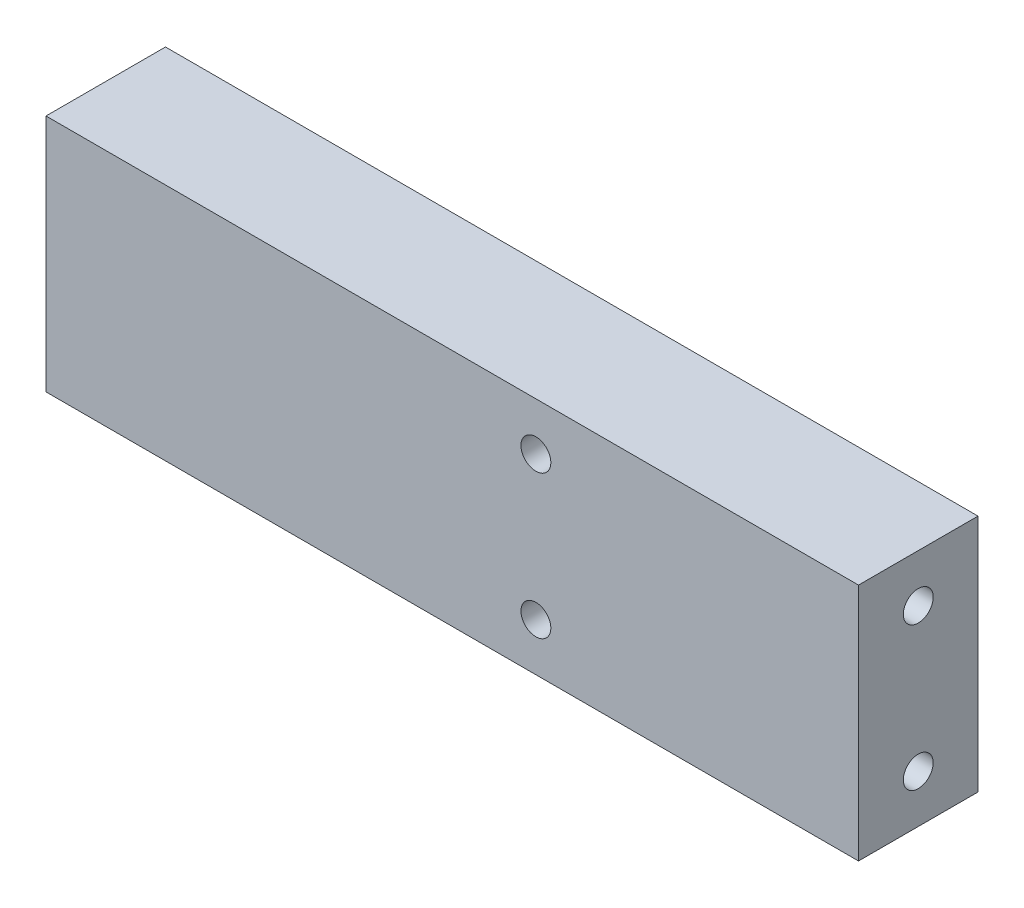
ISO-10303-21;
HEADER;
FILE_DESCRIPTION(('STEP AP214'),'2;1');
FILE_NAME('part.step','',(''),(''),'','','');
FILE_SCHEMA(('AUTOMOTIVE_DESIGN { 1 0 10303 214 1 1 1 1 }'));
ENDSEC;
DATA;
#1=APPLICATION_CONTEXT('core data for automotive mechanical design processes');
#2=APPLICATION_PROTOCOL_DEFINITION('international standard','automotive_design',2000,#1);
#3=PRODUCT_CONTEXT('',#1,'mechanical');
#4=PRODUCT('Part','Part','',(#3));
#5=PRODUCT_RELATED_PRODUCT_CATEGORY('part','',(#4));
#6=PRODUCT_DEFINITION_FORMATION('','',#4);
#7=PRODUCT_DEFINITION_CONTEXT('part definition',#1,'design');
#8=PRODUCT_DEFINITION('design','',#6,#7);
#9=PRODUCT_DEFINITION_SHAPE('','',#8);
#10=(LENGTH_UNIT() NAMED_UNIT(*) SI_UNIT(.MILLI.,.METRE.));
#11=(NAMED_UNIT(*) PLANE_ANGLE_UNIT() SI_UNIT($,.RADIAN.));
#12=(NAMED_UNIT(*) SI_UNIT($,.STERADIAN.) SOLID_ANGLE_UNIT());
#13=UNCERTAINTY_MEASURE_WITH_UNIT(LENGTH_MEASURE(1.E-05),#10,'distance_accuracy_value','');
#14=(GEOMETRIC_REPRESENTATION_CONTEXT(3) GLOBAL_UNCERTAINTY_ASSIGNED_CONTEXT((#13)) GLOBAL_UNIT_ASSIGNED_CONTEXT((#10,
#11,#12)) REPRESENTATION_CONTEXT('',''));
#15=CARTESIAN_POINT('',(0.,0.,0.));
#16=DIRECTION('',(0.,0.,1.));
#17=DIRECTION('',(1.,0.,0.));
#18=AXIS2_PLACEMENT_3D('',#15,#16,#17);
#19=CARTESIAN_POINT('',(7.,16.,2.50000000005457));
#20=DIRECTION('',(0.,0.,1.));
#21=DIRECTION('',(1.,0.,0.));
#22=AXIS2_PLACEMENT_3D('',#19,#20,#21);
#23=CONICAL_SURFACE('',#22,1.25000000003228,1.02974425855842);
#24=CARTESIAN_POINT('',(6.99999999991974,16.,1.74892422620587));
#25=VERTEX_POINT('',#24);
#26=VERTEX_LOOP('',#25);
#27=FACE_BOUND('',#26,.T.);
#28=CARTESIAN_POINT('',(7.,16.,2.5));
#29=DIRECTION('',(0.,0.,1.));
#30=DIRECTION('',(1.,0.,0.));
#31=AXIS2_PLACEMENT_3D('',#28,#29,#30);
#32=CIRCLE('',#31,1.24999999999999);
#33=CARTESIAN_POINT('',(8.24999999999999,16.,2.5));
#34=VERTEX_POINT('',#33);
#35=EDGE_CURVE('E77',#34,#34,#32,.T.);
#36=ORIENTED_EDGE('',*,*,#35,.T.);
#37=EDGE_LOOP('',(#36));
#38=FACE_BOUND('',#37,.T.);
#39=ADVANCED_FACE('F16',(#27,#38),#23,.F.);
#40=CARTESIAN_POINT('',(7.,4.,2.50000000005457));
#41=DIRECTION('',(0.,0.,1.));
#42=DIRECTION('',(1.,0.,0.));
#43=AXIS2_PLACEMENT_3D('',#40,#41,#42);
#44=CONICAL_SURFACE('',#43,1.25000000003228,1.02974425855842);
#45=CARTESIAN_POINT('',(6.99999999991974,4.,1.74892422620587));
#46=VERTEX_POINT('',#45);
#47=VERTEX_LOOP('',#46);
#48=FACE_BOUND('',#47,.T.);
#49=CARTESIAN_POINT('',(7.,4.,2.5));
#50=DIRECTION('',(0.,0.,1.));
#51=DIRECTION('',(1.,0.,0.));
#52=AXIS2_PLACEMENT_3D('',#49,#50,#51);
#53=CIRCLE('',#52,1.24999999999999);
#54=CARTESIAN_POINT('',(8.24999999999999,4.,2.5));
#55=VERTEX_POINT('',#54);
#56=EDGE_CURVE('E79',#55,#55,#53,.T.);
#57=ORIENTED_EDGE('',*,*,#56,.T.);
#58=EDGE_LOOP('',(#57));
#59=FACE_BOUND('',#58,.T.);
#60=ADVANCED_FACE('F74',(#48,#59),#44,.F.);
#61=CARTESIAN_POINT('',(25.5000000000223,16.,5.));
#62=DIRECTION('',(1.,0.,0.));
#63=DIRECTION('',(0.,0.,-1.));
#64=AXIS2_PLACEMENT_3D('',#61,#62,#63);
#65=CONICAL_SURFACE('',#64,1.24999999991815,1.02974425860485);
#66=CARTESIAN_POINT('',(24.7489242262589,16.,5.00000000005684));
#67=VERTEX_POINT('',#66);
#68=VERTEX_LOOP('',#67);
#69=FACE_BOUND('',#68,.T.);
#70=CARTESIAN_POINT('',(25.5,16.,5.));
#71=DIRECTION('',(1.,0.,0.));
#72=DIRECTION('',(0.,0.,-1.));
#73=AXIS2_PLACEMENT_3D('',#70,#71,#72);
#74=CIRCLE('',#73,1.24999999999999);
#75=CARTESIAN_POINT('',(25.5,16.,3.75000000000001));
#76=VERTEX_POINT('',#75);
#77=EDGE_CURVE('E82',#76,#76,#74,.T.);
#78=ORIENTED_EDGE('',*,*,#77,.T.);
#79=EDGE_LOOP('',(#78));
#80=FACE_BOUND('',#79,.T.);
#81=ADVANCED_FACE('F123',(#69,#80),#65,.F.);
#82=CARTESIAN_POINT('',(25.5000000000223,4.,5.));
#83=DIRECTION('',(1.,0.,0.));
#84=DIRECTION('',(0.,0.,-1.));
#85=AXIS2_PLACEMENT_3D('',#82,#83,#84);
#86=CONICAL_SURFACE('',#85,1.25000000003183,1.02974425868194);
#87=CARTESIAN_POINT('',(24.7489242262304,4.,5.));
#88=VERTEX_POINT('',#87);
#89=VERTEX_LOOP('',#88);
#90=FACE_BOUND('',#89,.T.);
#91=CARTESIAN_POINT('',(25.5,4.,5.));
#92=DIRECTION('',(1.,0.,0.));
#93=DIRECTION('',(0.,0.,-1.));
#94=AXIS2_PLACEMENT_3D('',#91,#92,#93);
#95=CIRCLE('',#94,1.24999999999999);
#96=CARTESIAN_POINT('',(25.5,4.,3.75000000000001));
#97=VERTEX_POINT('',#96);
#98=EDGE_CURVE('E115',#97,#97,#95,.T.);
#99=ORIENTED_EDGE('',*,*,#98,.T.);
#100=EDGE_LOOP('',(#99));
#101=FACE_BOUND('',#100,.T.);
#102=ADVANCED_FACE('F220',(#90,#101),#86,.F.);
#103=CARTESIAN_POINT('',(-25.4999999999654,16.,5.));
#104=DIRECTION('',(-1.,0.,0.));
#105=DIRECTION('',(0.,-1.,0.));
#106=AXIS2_PLACEMENT_3D('',#103,#104,#105);
#107=CONICAL_SURFACE('',#106,1.24999999985221,1.02974425855827);
#108=CARTESIAN_POINT('',(-24.748924226202,16.,4.99999999994316));
#109=VERTEX_POINT('',#108);
#110=VERTEX_LOOP('',#109);
#111=FACE_BOUND('',#110,.T.);
#112=CARTESIAN_POINT('',(-25.5,16.,5.));
#113=DIRECTION('',(-1.,0.,0.));
#114=DIRECTION('',(0.,0.,1.));
#115=AXIS2_PLACEMENT_3D('',#112,#113,#114);
#116=CIRCLE('',#115,1.24999999999999);
#117=CARTESIAN_POINT('',(-25.5,16.,6.24999999999999));
#118=VERTEX_POINT('',#117);
#119=EDGE_CURVE('E110',#118,#118,#116,.T.);
#120=ORIENTED_EDGE('',*,*,#119,.T.);
#121=EDGE_LOOP('',(#120));
#122=FACE_BOUND('',#121,.T.);
#123=ADVANCED_FACE('F216',(#111,#122),#107,.F.);
#124=CARTESIAN_POINT('',(-25.4999999999654,4.,5.));
#125=DIRECTION('',(-1.,0.,0.));
#126=DIRECTION('',(0.,-1.,0.));
#127=AXIS2_PLACEMENT_3D('',#124,#125,#126);
#128=CONICAL_SURFACE('',#127,1.24999999996589,1.02974425863858);
#129=CARTESIAN_POINT('',(-24.7489242261736,4.,5.));
#130=VERTEX_POINT('',#129);
#131=VERTEX_LOOP('',#130);
#132=FACE_BOUND('',#131,.T.);
#133=CARTESIAN_POINT('',(-25.5,4.,5.));
#134=DIRECTION('',(-1.,0.,0.));
#135=DIRECTION('',(0.,0.,1.));
#136=AXIS2_PLACEMENT_3D('',#133,#134,#135);
#137=CIRCLE('',#136,1.24999999999999);
#138=CARTESIAN_POINT('',(-25.5,4.,6.24999999999999));
#139=VERTEX_POINT('',#138);
#140=EDGE_CURVE('E106',#139,#139,#137,.T.);
#141=ORIENTED_EDGE('',*,*,#140,.T.);
#142=EDGE_LOOP('',(#141));
#143=FACE_BOUND('',#142,.T.);
#144=ADVANCED_FACE('F212',(#132,#143),#128,.F.);
#145=CARTESIAN_POINT('',(7.,16.,10.));
#146=DIRECTION('',(0.,0.,1.));
#147=DIRECTION('',(1.,0.,0.));
#148=AXIS2_PLACEMENT_3D('',#145,#146,#147);
#149=CYLINDRICAL_SURFACE('',#148,1.24999999999999);
#150=CARTESIAN_POINT('',(7.,16.,10.));
#151=DIRECTION('',(0.,0.,1.));
#152=DIRECTION('',(1.,0.,0.));
#153=AXIS2_PLACEMENT_3D('',#150,#151,#152);
#154=CIRCLE('',#153,1.24999999999999);
#155=CARTESIAN_POINT('',(8.24999999999999,16.,10.));
#156=VERTEX_POINT('',#155);
#157=EDGE_CURVE('E19',#156,#156,#154,.F.);
#158=ORIENTED_EDGE('',*,*,#157,.F.);
#159=EDGE_LOOP('',(#158));
#160=FACE_BOUND('',#159,.T.);
#161=ORIENTED_EDGE('',*,*,#35,.F.);
#162=EDGE_LOOP('',(#161));
#163=FACE_BOUND('',#162,.T.);
#164=ADVANCED_FACE('F208',(#160,#163),#149,.F.);
#165=CARTESIAN_POINT('',(7.,4.,10.));
#166=DIRECTION('',(0.,0.,1.));
#167=DIRECTION('',(1.,0.,0.));
#168=AXIS2_PLACEMENT_3D('',#165,#166,#167);
#169=CYLINDRICAL_SURFACE('',#168,1.24999999999999);
#170=CARTESIAN_POINT('',(7.,4.,10.));
#171=DIRECTION('',(0.,0.,1.));
#172=DIRECTION('',(1.,0.,0.));
#173=AXIS2_PLACEMENT_3D('',#170,#171,#172);
#174=CIRCLE('',#173,1.24999999999999);
#175=CARTESIAN_POINT('',(8.24999999999999,4.,10.));
#176=VERTEX_POINT('',#175);
#177=EDGE_CURVE('E100',#176,#176,#174,.F.);
#178=ORIENTED_EDGE('',*,*,#177,.F.);
#179=EDGE_LOOP('',(#178));
#180=FACE_BOUND('',#179,.T.);
#181=ORIENTED_EDGE('',*,*,#56,.F.);
#182=EDGE_LOOP('',(#181));
#183=FACE_BOUND('',#182,.T.);
#184=ADVANCED_FACE('F129',(#180,#183),#169,.F.);
#185=CARTESIAN_POINT('',(34.,16.,5.));
#186=DIRECTION('',(1.,0.,0.));
#187=DIRECTION('',(0.,0.,-1.));
#188=AXIS2_PLACEMENT_3D('',#185,#186,#187);
#189=CYLINDRICAL_SURFACE('',#188,1.24999999999999);
#190=ORIENTED_EDGE('',*,*,#77,.F.);
#191=EDGE_LOOP('',(#190));
#192=FACE_BOUND('',#191,.T.);
#193=CARTESIAN_POINT('',(34.,16.,5.));
#194=DIRECTION('',(1.,0.,0.));
#195=DIRECTION('',(0.,0.,-1.));
#196=AXIS2_PLACEMENT_3D('',#193,#194,#195);
#197=CIRCLE('',#196,1.24999999999999);
#198=CARTESIAN_POINT('',(34.,16.,3.75000000000001));
#199=VERTEX_POINT('',#198);
#200=EDGE_CURVE('E97',#199,#199,#197,.T.);
#201=ORIENTED_EDGE('',*,*,#200,.T.);
#202=EDGE_LOOP('',(#201));
#203=FACE_BOUND('',#202,.T.);
#204=ADVANCED_FACE('F125',(#192,#203),#189,.F.);
#205=CARTESIAN_POINT('',(34.,4.,5.));
#206=DIRECTION('',(1.,0.,0.));
#207=DIRECTION('',(0.,0.,-1.));
#208=AXIS2_PLACEMENT_3D('',#205,#206,#207);
#209=CYLINDRICAL_SURFACE('',#208,1.24999999999999);
#210=ORIENTED_EDGE('',*,*,#98,.F.);
#211=EDGE_LOOP('',(#210));
#212=FACE_BOUND('',#211,.T.);
#213=CARTESIAN_POINT('',(34.,4.,5.));
#214=DIRECTION('',(1.,0.,0.));
#215=DIRECTION('',(0.,0.,-1.));
#216=AXIS2_PLACEMENT_3D('',#213,#214,#215);
#217=CIRCLE('',#216,1.24999999999999);
#218=CARTESIAN_POINT('',(34.,4.,3.75000000000001));
#219=VERTEX_POINT('',#218);
#220=EDGE_CURVE('E93',#219,#219,#217,.T.);
#221=ORIENTED_EDGE('',*,*,#220,.T.);
#222=EDGE_LOOP('',(#221));
#223=FACE_BOUND('',#222,.T.);
#224=ADVANCED_FACE('F128',(#212,#223),#209,.F.);
#225=CARTESIAN_POINT('',(-34.,16.,5.));
#226=DIRECTION('',(-1.,0.,0.));
#227=DIRECTION('',(0.,0.,1.));
#228=AXIS2_PLACEMENT_3D('',#225,#226,#227);
#229=CYLINDRICAL_SURFACE('',#228,1.24999999999999);
#230=ORIENTED_EDGE('',*,*,#119,.F.);
#231=EDGE_LOOP('',(#230));
#232=FACE_BOUND('',#231,.T.);
#233=CARTESIAN_POINT('',(-34.,16.,5.));
#234=DIRECTION('',(-1.,0.,0.));
#235=DIRECTION('',(0.,0.,1.));
#236=AXIS2_PLACEMENT_3D('',#233,#234,#235);
#237=CIRCLE('',#236,1.24999999999999);
#238=CARTESIAN_POINT('',(-34.,16.,6.24999999999999));
#239=VERTEX_POINT('',#238);
#240=EDGE_CURVE('E89',#239,#239,#237,.T.);
#241=ORIENTED_EDGE('',*,*,#240,.T.);
#242=EDGE_LOOP('',(#241));
#243=FACE_BOUND('',#242,.T.);
#244=ADVANCED_FACE('F190',(#232,#243),#229,.F.);
#245=CARTESIAN_POINT('',(-34.,4.,5.));
#246=DIRECTION('',(-1.,0.,0.));
#247=DIRECTION('',(0.,0.,1.));
#248=AXIS2_PLACEMENT_3D('',#245,#246,#247);
#249=CYLINDRICAL_SURFACE('',#248,1.24999999999999);
#250=ORIENTED_EDGE('',*,*,#140,.F.);
#251=EDGE_LOOP('',(#250));
#252=FACE_BOUND('',#251,.T.);
#253=CARTESIAN_POINT('',(-34.,4.,5.));
#254=DIRECTION('',(-1.,0.,0.));
#255=DIRECTION('',(0.,0.,1.));
#256=AXIS2_PLACEMENT_3D('',#253,#254,#255);
#257=CIRCLE('',#256,1.24999999999999);
#258=CARTESIAN_POINT('',(-34.,4.,6.24999999999999));
#259=VERTEX_POINT('',#258);
#260=EDGE_CURVE('E86',#259,#259,#257,.T.);
#261=ORIENTED_EDGE('',*,*,#260,.T.);
#262=EDGE_LOOP('',(#261));
#263=FACE_BOUND('',#262,.T.);
#264=ADVANCED_FACE('F192',(#252,#263),#249,.F.);
#265=CARTESIAN_POINT('',(0.,0.,10.));
#266=DIRECTION('',(0.,0.,1.));
#267=DIRECTION('',(1.,0.,0.));
#268=AXIS2_PLACEMENT_3D('',#265,#266,#267);
#269=PLANE('',#268);
#270=DIRECTION('',(0.,1.,0.));
#271=VECTOR('',#270,1.);
#272=CARTESIAN_POINT('',(34.,20.,10.));
#273=LINE('',#272,#271);
#274=CARTESIAN_POINT('',(34.,0.,10.));
#275=VERTEX_POINT('',#274);
#276=CARTESIAN_POINT('',(34.,20.,10.));
#277=VERTEX_POINT('',#276);
#278=EDGE_CURVE('E183',#275,#277,#273,.T.);
#279=ORIENTED_EDGE('',*,*,#278,.T.);
#280=DIRECTION('',(1.,0.,0.));
#281=VECTOR('',#280,1.);
#282=CARTESIAN_POINT('',(-34.,20.,10.));
#283=LINE('',#282,#281);
#284=CARTESIAN_POINT('',(-34.,20.,10.));
#285=VERTEX_POINT('',#284);
#286=EDGE_CURVE('E92',#277,#285,#283,.F.);
#287=ORIENTED_EDGE('',*,*,#286,.T.);
#288=DIRECTION('',(0.,1.,0.));
#289=VECTOR('',#288,1.);
#290=CARTESIAN_POINT('',(-34.,20.,10.));
#291=LINE('',#290,#289);
#292=CARTESIAN_POINT('',(-34.,0.,10.));
#293=VERTEX_POINT('',#292);
#294=EDGE_CURVE('E177',#285,#293,#291,.F.);
#295=ORIENTED_EDGE('',*,*,#294,.T.);
#296=DIRECTION('',(1.,0.,0.));
#297=VECTOR('',#296,1.);
#298=CARTESIAN_POINT('',(-34.,0.,10.));
#299=LINE('',#298,#297);
#300=EDGE_CURVE('E99',#293,#275,#299,.T.);
#301=ORIENTED_EDGE('',*,*,#300,.T.);
#302=EDGE_LOOP('',(#279,#287,#295,#301));
#303=FACE_BOUND('',#302,.T.);
#304=ORIENTED_EDGE('',*,*,#177,.T.);
#305=EDGE_LOOP('',(#304));
#306=FACE_BOUND('',#305,.T.);
#307=ORIENTED_EDGE('',*,*,#157,.T.);
#308=EDGE_LOOP('',(#307));
#309=FACE_BOUND('',#308,.T.);
#310=ADVANCED_FACE('F147',(#303,#306,#309),#269,.T.);
#311=CARTESIAN_POINT('',(-34.,0.,10.));
#312=DIRECTION('',(0.,1.,0.));
#313=DIRECTION('',(0.,0.,1.));
#314=AXIS2_PLACEMENT_3D('',#311,#312,#313);
#315=PLANE('',#314);
#316=DIRECTION('',(0.,0.,1.));
#317=VECTOR('',#316,1.);
#318=CARTESIAN_POINT('',(34.,0.,10.));
#319=LINE('',#318,#317);
#320=CARTESIAN_POINT('',(34.,0.,0.));
#321=VERTEX_POINT('',#320);
#322=EDGE_CURVE('E96',#321,#275,#319,.T.);
#323=ORIENTED_EDGE('',*,*,#322,.T.);
#324=ORIENTED_EDGE('',*,*,#300,.F.);
#325=DIRECTION('',(0.,0.,-1.));
#326=VECTOR('',#325,1.);
#327=CARTESIAN_POINT('',(-34.,0.,10.));
#328=LINE('',#327,#326);
#329=CARTESIAN_POINT('',(-34.,0.,0.));
#330=VERTEX_POINT('',#329);
#331=EDGE_CURVE('E172',#293,#330,#328,.T.);
#332=ORIENTED_EDGE('',*,*,#331,.T.);
#333=DIRECTION('',(1.,0.,0.));
#334=VECTOR('',#333,1.);
#335=CARTESIAN_POINT('',(0.,0.,0.));
#336=LINE('',#335,#334);
#337=EDGE_CURVE('E170',#330,#321,#336,.T.);
#338=ORIENTED_EDGE('',*,*,#337,.T.);
#339=EDGE_LOOP('',(#323,#324,#332,#338));
#340=FACE_BOUND('',#339,.T.);
#341=ADVANCED_FACE('F136',(#340),#315,.F.);
#342=CARTESIAN_POINT('',(34.,20.,10.));
#343=DIRECTION('',(-1.,0.,0.));
#344=DIRECTION('',(0.,0.,1.));
#345=AXIS2_PLACEMENT_3D('',#342,#343,#344);
#346=PLANE('',#345);
#347=DIRECTION('',(0.,0.,-1.));
#348=VECTOR('',#347,1.);
#349=CARTESIAN_POINT('',(34.,20.,10.));
#350=LINE('',#349,#348);
#351=CARTESIAN_POINT('',(34.,20.,0.));
#352=VERTEX_POINT('',#351);
#353=EDGE_CURVE('E168',#352,#277,#350,.F.);
#354=ORIENTED_EDGE('',*,*,#353,.T.);
#355=ORIENTED_EDGE('',*,*,#278,.F.);
#356=ORIENTED_EDGE('',*,*,#322,.F.);
#357=DIRECTION('',(0.,1.,0.));
#358=VECTOR('',#357,1.);
#359=CARTESIAN_POINT('',(34.,0.,0.));
#360=LINE('',#359,#358);
#361=EDGE_CURVE('E164',#321,#352,#360,.T.);
#362=ORIENTED_EDGE('',*,*,#361,.T.);
#363=EDGE_LOOP('',(#354,#355,#356,#362));
#364=FACE_BOUND('',#363,.T.);
#365=ORIENTED_EDGE('',*,*,#220,.F.);
#366=EDGE_LOOP('',(#365));
#367=FACE_BOUND('',#366,.T.);
#368=ORIENTED_EDGE('',*,*,#200,.F.);
#369=EDGE_LOOP('',(#368));
#370=FACE_BOUND('',#369,.T.);
#371=ADVANCED_FACE('F133',(#364,#367,#370),#346,.F.);
#372=CARTESIAN_POINT('',(-34.,20.,10.));
#373=DIRECTION('',(0.,-1.,0.));
#374=DIRECTION('',(0.,0.,-1.));
#375=AXIS2_PLACEMENT_3D('',#372,#373,#374);
#376=PLANE('',#375);
#377=DIRECTION('',(0.,0.,-1.));
#378=VECTOR('',#377,1.);
#379=CARTESIAN_POINT('',(-34.,20.,10.));
#380=LINE('',#379,#378);
#381=CARTESIAN_POINT('',(-34.,20.,0.));
#382=VERTEX_POINT('',#381);
#383=EDGE_CURVE('E33',#382,#285,#380,.F.);
#384=ORIENTED_EDGE('',*,*,#383,.T.);
#385=ORIENTED_EDGE('',*,*,#286,.F.);
#386=ORIENTED_EDGE('',*,*,#353,.F.);
#387=DIRECTION('',(1.,0.,0.));
#388=VECTOR('',#387,1.);
#389=CARTESIAN_POINT('',(0.,20.,0.));
#390=LINE('',#389,#388);
#391=EDGE_CURVE('E25',#352,#382,#390,.F.);
#392=ORIENTED_EDGE('',*,*,#391,.T.);
#393=EDGE_LOOP('',(#384,#385,#386,#392));
#394=FACE_BOUND('',#393,.T.);
#395=ADVANCED_FACE('F135',(#394),#376,.F.);
#396=CARTESIAN_POINT('',(-34.,20.,10.));
#397=DIRECTION('',(1.,0.,0.));
#398=DIRECTION('',(0.,0.,-1.));
#399=AXIS2_PLACEMENT_3D('',#396,#397,#398);
#400=PLANE('',#399);
#401=ORIENTED_EDGE('',*,*,#331,.F.);
#402=ORIENTED_EDGE('',*,*,#294,.F.);
#403=ORIENTED_EDGE('',*,*,#383,.F.);
#404=DIRECTION('',(0.,1.,0.));
#405=VECTOR('',#404,1.);
#406=CARTESIAN_POINT('',(-34.,0.,0.));
#407=LINE('',#406,#405);
#408=EDGE_CURVE('E11',#382,#330,#407,.F.);
#409=ORIENTED_EDGE('',*,*,#408,.T.);
#410=EDGE_LOOP('',(#401,#402,#403,#409));
#411=FACE_BOUND('',#410,.T.);
#412=ORIENTED_EDGE('',*,*,#260,.F.);
#413=EDGE_LOOP('',(#412));
#414=FACE_BOUND('',#413,.T.);
#415=ORIENTED_EDGE('',*,*,#240,.F.);
#416=EDGE_LOOP('',(#415));
#417=FACE_BOUND('',#416,.T.);
#418=ADVANCED_FACE('F144',(#411,#414,#417),#400,.F.);
#419=CARTESIAN_POINT('',(0.,0.,0.));
#420=DIRECTION('',(0.,0.,1.));
#421=DIRECTION('',(1.,0.,0.));
#422=AXIS2_PLACEMENT_3D('',#419,#420,#421);
#423=PLANE('',#422);
#424=ORIENTED_EDGE('',*,*,#391,.F.);
#425=ORIENTED_EDGE('',*,*,#361,.F.);
#426=ORIENTED_EDGE('',*,*,#337,.F.);
#427=ORIENTED_EDGE('',*,*,#408,.F.);
#428=EDGE_LOOP('',(#424,#425,#426,#427));
#429=FACE_BOUND('',#428,.T.);
#430=ADVANCED_FACE('F152',(#429),#423,.F.);
#431=CLOSED_SHELL('',(#39,#60,#81,#102,#123,#144,#164,#184,#204,#224,#244,#264,#310,#341,#371,
#395,#418,#430));
#432=MANIFOLD_SOLID_BREP('B1',#431);
#433=ADVANCED_BREP_SHAPE_REPRESENTATION('',(#18,#432),#14);
#434=SHAPE_DEFINITION_REPRESENTATION(#9,#433);
ENDSEC;
END-ISO-10303-21;
